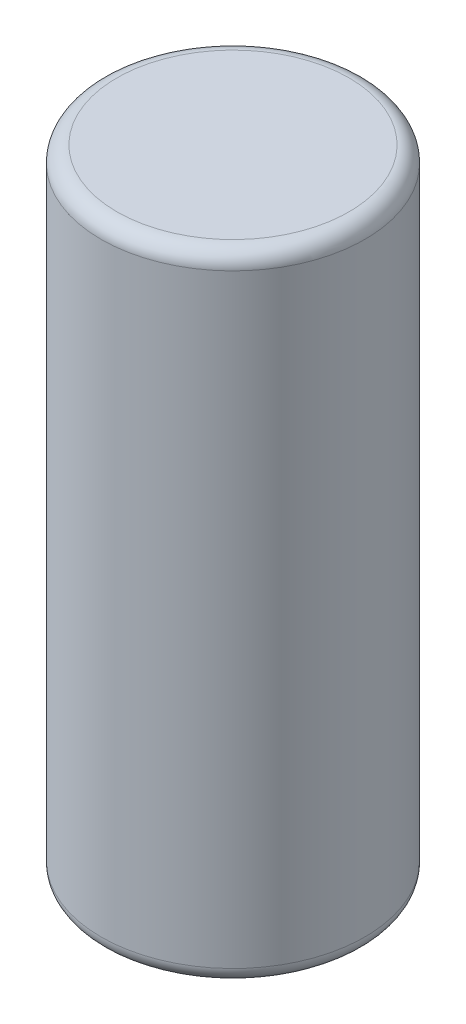
ISO-10303-21;
HEADER;
FILE_DESCRIPTION(('STEP AP214'),'2;1');
FILE_NAME('part.step','',(''),(''),'','','');
FILE_SCHEMA(('AUTOMOTIVE_DESIGN { 1 0 10303 214 1 1 1 1 }'));
ENDSEC;
DATA;
#1=APPLICATION_CONTEXT('core data for automotive mechanical design processes');
#2=APPLICATION_PROTOCOL_DEFINITION('international standard','automotive_design',2000,#1);
#3=PRODUCT_CONTEXT('',#1,'mechanical');
#4=PRODUCT('Part','Part','',(#3));
#5=PRODUCT_RELATED_PRODUCT_CATEGORY('part','',(#4));
#6=PRODUCT_DEFINITION_FORMATION('','',#4);
#7=PRODUCT_DEFINITION_CONTEXT('part definition',#1,'design');
#8=PRODUCT_DEFINITION('design','',#6,#7);
#9=PRODUCT_DEFINITION_SHAPE('','',#8);
#10=(LENGTH_UNIT() NAMED_UNIT(*) SI_UNIT(.MILLI.,.METRE.));
#11=(NAMED_UNIT(*) PLANE_ANGLE_UNIT() SI_UNIT($,.RADIAN.));
#12=(NAMED_UNIT(*) SI_UNIT($,.STERADIAN.) SOLID_ANGLE_UNIT());
#13=UNCERTAINTY_MEASURE_WITH_UNIT(LENGTH_MEASURE(1.E-05),#10,'distance_accuracy_value','');
#14=(GEOMETRIC_REPRESENTATION_CONTEXT(3) GLOBAL_UNCERTAINTY_ASSIGNED_CONTEXT((#13)) GLOBAL_UNIT_ASSIGNED_CONTEXT((#10,
#11,#12)) REPRESENTATION_CONTEXT('',''));
#15=CARTESIAN_POINT('',(0.,0.,0.));
#16=DIRECTION('',(0.,0.,1.));
#17=DIRECTION('',(1.,0.,0.));
#18=AXIS2_PLACEMENT_3D('',#15,#16,#17);
#19=CARTESIAN_POINT('',(0.,20.,0.));
#20=DIRECTION('',(0.,-1.,0.));
#21=DIRECTION('',(0.,0.,-1.));
#22=AXIS2_PLACEMENT_3D('',#19,#20,#21);
#23=CYLINDRICAL_SURFACE('',#22,4.15);
#24=CARTESIAN_POINT('',(0.,0.5,0.));
#25=DIRECTION('',(0.,1.,0.));
#26=DIRECTION('',(0.,0.,1.));
#27=AXIS2_PLACEMENT_3D('',#24,#25,#26);
#28=CIRCLE('',#27,4.15);
#29=CARTESIAN_POINT('',(0.,0.5,4.15));
#30=VERTEX_POINT('',#29);
#31=EDGE_CURVE('E43',#30,#30,#28,.T.);
#32=ORIENTED_EDGE('',*,*,#31,.T.);
#33=EDGE_LOOP('',(#32));
#34=FACE_BOUND('',#33,.T.);
#35=CARTESIAN_POINT('',(0.,19.5,0.));
#36=DIRECTION('',(0.,1.,0.));
#37=DIRECTION('',(0.,0.,1.));
#38=AXIS2_PLACEMENT_3D('',#35,#36,#37);
#39=CIRCLE('',#38,4.15);
#40=CARTESIAN_POINT('',(0.,19.5,4.15));
#41=VERTEX_POINT('',#40);
#42=EDGE_CURVE('E47',#41,#41,#39,.F.);
#43=ORIENTED_EDGE('',*,*,#42,.T.);
#44=EDGE_LOOP('',(#43));
#45=FACE_BOUND('',#44,.T.);
#46=ADVANCED_FACE('F32',(#34,#45),#23,.T.);
#47=CARTESIAN_POINT('',(0.,20.,0.));
#48=DIRECTION('',(0.,1.,0.));
#49=DIRECTION('',(0.,0.,1.));
#50=AXIS2_PLACEMENT_3D('',#47,#48,#49);
#51=PLANE('',#50);
#52=CARTESIAN_POINT('',(0.,20.,0.));
#53=DIRECTION('',(0.,1.,0.));
#54=DIRECTION('',(0.,0.,1.));
#55=AXIS2_PLACEMENT_3D('',#52,#53,#54);
#56=CIRCLE('',#55,3.65);
#57=CARTESIAN_POINT('',(0.,20.,3.65));
#58=VERTEX_POINT('',#57);
#59=EDGE_CURVE('E10',#58,#58,#56,.T.);
#60=ORIENTED_EDGE('',*,*,#59,.T.);
#61=EDGE_LOOP('',(#60));
#62=FACE_BOUND('',#61,.T.);
#63=ADVANCED_FACE('F63',(#62),#51,.T.);
#64=CARTESIAN_POINT('',(0.,0.,0.));
#65=DIRECTION('',(0.,1.,0.));
#66=DIRECTION('',(0.,0.,1.));
#67=AXIS2_PLACEMENT_3D('',#64,#65,#66);
#68=PLANE('',#67);
#69=CARTESIAN_POINT('',(0.,0.,0.));
#70=DIRECTION('',(0.,1.,0.));
#71=DIRECTION('',(0.,0.,1.));
#72=AXIS2_PLACEMENT_3D('',#69,#70,#71);
#73=CIRCLE('',#72,3.65);
#74=CARTESIAN_POINT('',(0.,0.,3.65));
#75=VERTEX_POINT('',#74);
#76=EDGE_CURVE('E39',#75,#75,#73,.F.);
#77=ORIENTED_EDGE('',*,*,#76,.T.);
#78=EDGE_LOOP('',(#77));
#79=FACE_BOUND('',#78,.T.);
#80=ADVANCED_FACE('F60',(#79),#68,.F.);
#81=CARTESIAN_POINT('',(0.,0.5,0.));
#82=DIRECTION('',(0.,1.,0.));
#83=DIRECTION('',(0.,0.,1.));
#84=AXIS2_PLACEMENT_3D('',#81,#82,#83);
#85=TOROIDAL_SURFACE('',#84,3.65,0.5);
#86=ORIENTED_EDGE('',*,*,#76,.F.);
#87=EDGE_LOOP('',(#86));
#88=FACE_BOUND('',#87,.T.);
#89=ORIENTED_EDGE('',*,*,#31,.F.);
#90=EDGE_LOOP('',(#89));
#91=FACE_BOUND('',#90,.T.);
#92=ADVANCED_FACE('F56',(#88,#91),#85,.T.);
#93=CARTESIAN_POINT('',(0.,19.5,0.));
#94=DIRECTION('',(0.,1.,0.));
#95=DIRECTION('',(0.,0.,1.));
#96=AXIS2_PLACEMENT_3D('',#93,#94,#95);
#97=TOROIDAL_SURFACE('',#96,3.65,0.5);
#98=ORIENTED_EDGE('',*,*,#42,.F.);
#99=EDGE_LOOP('',(#98));
#100=FACE_BOUND('',#99,.T.);
#101=ORIENTED_EDGE('',*,*,#59,.F.);
#102=EDGE_LOOP('',(#101));
#103=FACE_BOUND('',#102,.T.);
#104=ADVANCED_FACE('F34',(#100,#103),#97,.T.);
#105=CLOSED_SHELL('',(#46,#63,#80,#92,#104));
#106=MANIFOLD_SOLID_BREP('B2',#105);
#107=ADVANCED_BREP_SHAPE_REPRESENTATION('',(#18,#106),#14);
#108=SHAPE_DEFINITION_REPRESENTATION(#9,#107);
ENDSEC;
END-ISO-10303-21;
